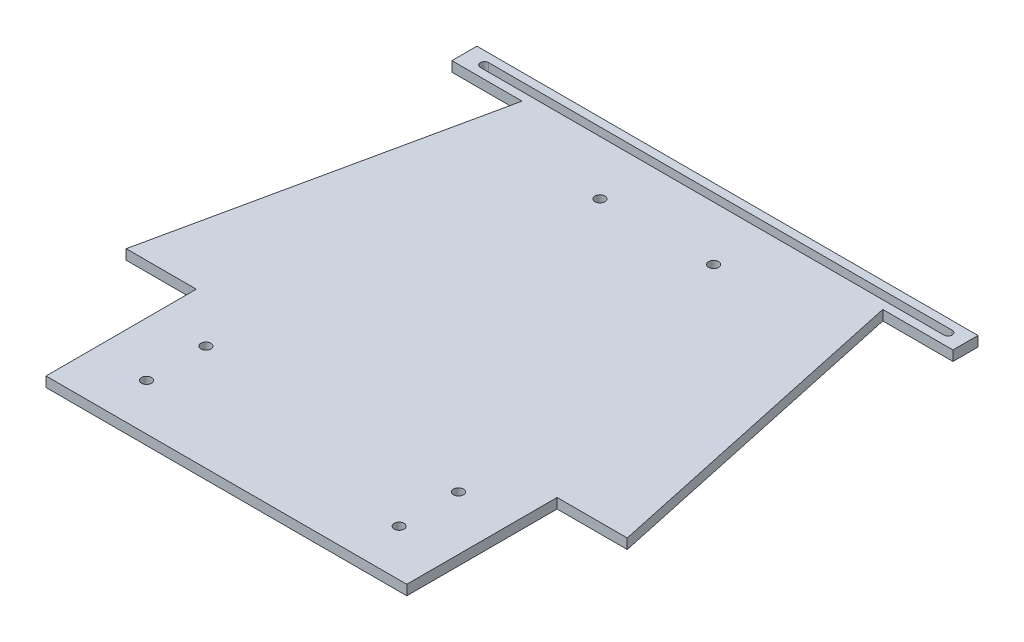
ISO-10303-21;
HEADER;
FILE_DESCRIPTION(('STEP AP214'),'2;1');
FILE_NAME('part.step','',(''),(''),'','','');
FILE_SCHEMA(('AUTOMOTIVE_DESIGN { 1 0 10303 214 1 1 1 1 }'));
ENDSEC;
DATA;
#1=APPLICATION_CONTEXT('core data for automotive mechanical design processes');
#2=APPLICATION_PROTOCOL_DEFINITION('international standard','automotive_design',2000,#1);
#3=PRODUCT_CONTEXT('',#1,'mechanical');
#4=PRODUCT('Part','Part','',(#3));
#5=PRODUCT_RELATED_PRODUCT_CATEGORY('part','',(#4));
#6=PRODUCT_DEFINITION_FORMATION('','',#4);
#7=PRODUCT_DEFINITION_CONTEXT('part definition',#1,'design');
#8=PRODUCT_DEFINITION('design','',#6,#7);
#9=PRODUCT_DEFINITION_SHAPE('','',#8);
#10=(LENGTH_UNIT() NAMED_UNIT(*) SI_UNIT(.MILLI.,.METRE.));
#11=(NAMED_UNIT(*) PLANE_ANGLE_UNIT() SI_UNIT($,.RADIAN.));
#12=(NAMED_UNIT(*) SI_UNIT($,.STERADIAN.) SOLID_ANGLE_UNIT());
#13=UNCERTAINTY_MEASURE_WITH_UNIT(LENGTH_MEASURE(1.E-05),#10,'distance_accuracy_value','');
#14=(GEOMETRIC_REPRESENTATION_CONTEXT(3) GLOBAL_UNCERTAINTY_ASSIGNED_CONTEXT((#13)) GLOBAL_UNIT_ASSIGNED_CONTEXT((#10,
#11,#12)) REPRESENTATION_CONTEXT('',''));
#15=CARTESIAN_POINT('',(0.,0.,0.));
#16=DIRECTION('',(0.,0.,1.));
#17=DIRECTION('',(1.,0.,0.));
#18=AXIS2_PLACEMENT_3D('',#15,#16,#17);
#19=CARTESIAN_POINT('',(0.,4.,0.));
#20=DIRECTION('',(0.,1.,0.));
#21=DIRECTION('',(0.,0.,1.));
#22=AXIS2_PLACEMENT_3D('',#19,#20,#21);
#23=PLANE('',#22);
#24=CARTESIAN_POINT('',(150.417794747506,4.,147.769246608483));
#25=DIRECTION('',(0.,1.,0.));
#26=DIRECTION('',(0.,0.,-1.));
#27=AXIS2_PLACEMENT_3D('',#24,#25,#26);
#28=CIRCLE('',#27,2.);
#29=CARTESIAN_POINT('',(150.417794747506,4.,145.769246608483));
#30=VERTEX_POINT('',#29);
#31=EDGE_CURVE('E209',#30,#30,#28,.T.);
#32=ORIENTED_EDGE('',*,*,#31,.F.);
#33=EDGE_LOOP('',(#32));
#34=FACE_BOUND('',#33,.T.);
#35=CARTESIAN_POINT('',(77.3055757206922,4.,18.2254973298112));
#36=DIRECTION('',(0.,1.,0.));
#37=DIRECTION('',(0.,0.,1.));
#38=AXIS2_PLACEMENT_3D('',#35,#36,#37);
#39=CIRCLE('',#38,2.);
#40=CARTESIAN_POINT('',(77.3055757206922,4.,20.2254973298112));
#41=VERTEX_POINT('',#40);
#42=EDGE_CURVE('E225',#41,#41,#39,.T.);
#43=ORIENTED_EDGE('',*,*,#42,.F.);
#44=EDGE_LOOP('',(#43));
#45=FACE_BOUND('',#44,.T.);
#46=CARTESIAN_POINT('',(49.5822052524939,4.,147.769246608483));
#47=DIRECTION('',(0.,1.,0.));
#48=DIRECTION('',(0.,0.,1.));
#49=AXIS2_PLACEMENT_3D('',#46,#47,#48);
#50=CIRCLE('',#49,2.);
#51=CARTESIAN_POINT('',(49.5822052524939,4.,149.769246608483));
#52=VERTEX_POINT('',#51);
#53=EDGE_CURVE('E241',#52,#52,#50,.T.);
#54=ORIENTED_EDGE('',*,*,#53,.F.);
#55=EDGE_LOOP('',(#54));
#56=FACE_BOUND('',#55,.T.);
#57=DIRECTION('',(0.,0.,1.));
#58=VECTOR('',#57,1.);
#59=CARTESIAN_POINT('',(0.,4.,-10.));
#60=LINE('',#59,#58);
#61=CARTESIAN_POINT('',(0.,4.,-10.));
#62=VERTEX_POINT('',#61);
#63=CARTESIAN_POINT('',(0.,4.,0.));
#64=VERTEX_POINT('',#63);
#65=EDGE_CURVE('E249',#62,#64,#60,.T.);
#66=ORIENTED_EDGE('',*,*,#65,.T.);
#67=DIRECTION('',(1.,0.,0.));
#68=VECTOR('',#67,1.);
#69=CARTESIAN_POINT('',(0.,4.,0.));
#70=LINE('',#69,#68);
#71=CARTESIAN_POINT('',(28.,4.,0.));
#72=VERTEX_POINT('',#71);
#73=EDGE_CURVE('E253',#64,#72,#70,.T.);
#74=ORIENTED_EDGE('',*,*,#73,.T.);
#75=DIRECTION('',(-0.210556075945089,0.,0.977581781173629));
#76=VECTOR('',#75,1.);
#77=CARTESIAN_POINT('',(28.,4.,0.));
#78=LINE('',#77,#76);
#79=CARTESIAN_POINT('',(0.,4.,130.));
#80=VERTEX_POINT('',#79);
#81=EDGE_CURVE('E257',#72,#80,#78,.T.);
#82=ORIENTED_EDGE('',*,*,#81,.T.);
#83=DIRECTION('',(1.,0.,0.));
#84=VECTOR('',#83,1.);
#85=CARTESIAN_POINT('',(0.,4.,130.));
#86=LINE('',#85,#84);
#87=CARTESIAN_POINT('',(28.,4.,130.));
#88=VERTEX_POINT('',#87);
#89=EDGE_CURVE('E260',#80,#88,#86,.T.);
#90=ORIENTED_EDGE('',*,*,#89,.T.);
#91=DIRECTION('',(0.,0.,1.));
#92=VECTOR('',#91,1.);
#93=CARTESIAN_POINT('',(28.,4.,130.));
#94=LINE('',#93,#92);
#95=CARTESIAN_POINT('',(28.,4.,190.));
#96=VERTEX_POINT('',#95);
#97=EDGE_CURVE('E263',#88,#96,#94,.T.);
#98=ORIENTED_EDGE('',*,*,#97,.T.);
#99=DIRECTION('',(1.,0.,0.));
#100=VECTOR('',#99,1.);
#101=CARTESIAN_POINT('',(28.,4.,190.));
#102=LINE('',#101,#100);
#103=CARTESIAN_POINT('',(172.,4.,190.));
#104=VERTEX_POINT('',#103);
#105=EDGE_CURVE('E266',#96,#104,#102,.T.);
#106=ORIENTED_EDGE('',*,*,#105,.T.);
#107=DIRECTION('',(0.,0.,-1.));
#108=VECTOR('',#107,1.);
#109=CARTESIAN_POINT('',(172.,4.,190.));
#110=LINE('',#109,#108);
#111=CARTESIAN_POINT('',(172.,4.,130.));
#112=VERTEX_POINT('',#111);
#113=EDGE_CURVE('E269',#104,#112,#110,.T.);
#114=ORIENTED_EDGE('',*,*,#113,.T.);
#115=DIRECTION('',(1.,0.,0.));
#116=VECTOR('',#115,1.);
#117=CARTESIAN_POINT('',(172.,4.,130.));
#118=LINE('',#117,#116);
#119=CARTESIAN_POINT('',(200.,4.,130.));
#120=VERTEX_POINT('',#119);
#121=EDGE_CURVE('E272',#112,#120,#118,.T.);
#122=ORIENTED_EDGE('',*,*,#121,.T.);
#123=DIRECTION('',(-0.210556075945089,0.,-0.977581781173629));
#124=VECTOR('',#123,1.);
#125=CARTESIAN_POINT('',(200.,4.,130.));
#126=LINE('',#125,#124);
#127=CARTESIAN_POINT('',(172.,4.,0.));
#128=VERTEX_POINT('',#127);
#129=EDGE_CURVE('E275',#120,#128,#126,.T.);
#130=ORIENTED_EDGE('',*,*,#129,.T.);
#131=DIRECTION('',(1.,0.,0.));
#132=VECTOR('',#131,1.);
#133=CARTESIAN_POINT('',(172.,4.,0.));
#134=LINE('',#133,#132);
#135=CARTESIAN_POINT('',(200.,4.,0.));
#136=VERTEX_POINT('',#135);
#137=EDGE_CURVE('E278',#128,#136,#134,.T.);
#138=ORIENTED_EDGE('',*,*,#137,.T.);
#139=DIRECTION('',(0.,0.,-1.));
#140=VECTOR('',#139,1.);
#141=CARTESIAN_POINT('',(200.,4.,0.));
#142=LINE('',#141,#140);
#143=CARTESIAN_POINT('',(200.,4.,-10.));
#144=VERTEX_POINT('',#143);
#145=EDGE_CURVE('E281',#136,#144,#142,.T.);
#146=ORIENTED_EDGE('',*,*,#145,.T.);
#147=DIRECTION('',(-1.,0.,0.));
#148=VECTOR('',#147,1.);
#149=CARTESIAN_POINT('',(200.,4.,-10.));
#150=LINE('',#149,#148);
#151=EDGE_CURVE('E284',#144,#62,#150,.T.);
#152=ORIENTED_EDGE('',*,*,#151,.T.);
#153=EDGE_LOOP('',(#66,#74,#82,#90,#98,#106,#114,#122,#130,#138,#146,#152));
#154=FACE_BOUND('',#153,.T.);
#155=CARTESIAN_POINT('',(49.5822052524939,4.,171.460126826762));
#156=DIRECTION('',(0.,1.,0.));
#157=DIRECTION('',(0.,0.,1.));
#158=AXIS2_PLACEMENT_3D('',#155,#156,#157);
#159=CIRCLE('',#158,2.);
#160=CARTESIAN_POINT('',(49.5822052524939,4.,173.460126826762));
#161=VERTEX_POINT('',#160);
#162=EDGE_CURVE('E233',#161,#161,#159,.T.);
#163=ORIENTED_EDGE('',*,*,#162,.F.);
#164=EDGE_LOOP('',(#163));
#165=FACE_BOUND('',#164,.T.);
#166=CARTESIAN_POINT('',(150.417794747506,4.,171.460126826762));
#167=DIRECTION('',(0.,1.,0.));
#168=DIRECTION('',(0.,0.,-1.));
#169=AXIS2_PLACEMENT_3D('',#166,#167,#168);
#170=CIRCLE('',#169,2.);
#171=CARTESIAN_POINT('',(150.417794747506,4.,169.460126826762));
#172=VERTEX_POINT('',#171);
#173=EDGE_CURVE('E217',#172,#172,#170,.T.);
#174=ORIENTED_EDGE('',*,*,#173,.F.);
#175=EDGE_LOOP('',(#174));
#176=FACE_BOUND('',#175,.T.);
#177=CARTESIAN_POINT('',(122.694424279308,4.,18.2254973298112));
#178=DIRECTION('',(0.,1.,0.));
#179=DIRECTION('',(0.,0.,-1.));
#180=AXIS2_PLACEMENT_3D('',#177,#178,#179);
#181=CIRCLE('',#180,2.);
#182=CARTESIAN_POINT('',(122.694424279308,4.,16.2254973298112));
#183=VERTEX_POINT('',#182);
#184=EDGE_CURVE('E201',#183,#183,#181,.T.);
#185=ORIENTED_EDGE('',*,*,#184,.F.);
#186=EDGE_LOOP('',(#185));
#187=FACE_BOUND('',#186,.T.);
#188=DIRECTION('',(1.,0.,0.));
#189=VECTOR('',#188,1.);
#190=CARTESIAN_POINT('',(8.04576511181479,4.,-3.34354151504071));
#191=LINE('',#190,#189);
#192=CARTESIAN_POINT('',(8.04576511181479,4.,-3.34354151504071));
#193=VERTEX_POINT('',#192);
#194=CARTESIAN_POINT('',(193.045765111815,4.,-3.34354151504071));
#195=VERTEX_POINT('',#194);
#196=EDGE_CURVE('E162',#193,#195,#191,.T.);
#197=ORIENTED_EDGE('',*,*,#196,.F.);
#198=CARTESIAN_POINT('',(8.04576511181479,4.,-5.));
#199=DIRECTION('',(0.,1.,0.));
#200=DIRECTION('',(0.,0.,1.));
#201=AXIS2_PLACEMENT_3D('',#198,#199,#200);
#202=CIRCLE('',#201,1.65645848495929);
#203=CARTESIAN_POINT('',(8.04576511181479,4.,-6.65645848495929));
#204=VERTEX_POINT('',#203);
#205=EDGE_CURVE('E153',#204,#193,#202,.T.);
#206=ORIENTED_EDGE('',*,*,#205,.F.);
#207=DIRECTION('',(-1.,0.,0.));
#208=VECTOR('',#207,1.);
#209=CARTESIAN_POINT('',(8.04576511181479,4.,-6.65645848495929));
#210=LINE('',#209,#208);
#211=CARTESIAN_POINT('',(193.045765111815,4.,-6.65645848495929));
#212=VERTEX_POINT('',#211);
#213=EDGE_CURVE('E179',#212,#204,#210,.T.);
#214=ORIENTED_EDGE('',*,*,#213,.F.);
#215=CARTESIAN_POINT('',(193.045765111815,4.,-5.));
#216=DIRECTION('',(0.,1.,0.));
#217=DIRECTION('',(0.,0.,1.));
#218=AXIS2_PLACEMENT_3D('',#215,#216,#217);
#219=CIRCLE('',#218,1.65645848495929);
#220=EDGE_CURVE('E175',#195,#212,#219,.T.);
#221=ORIENTED_EDGE('',*,*,#220,.F.);
#222=EDGE_LOOP('',(#197,#206,#214,#221));
#223=FACE_BOUND('',#222,.T.);
#224=ADVANCED_FACE('F39',(#34,#45,#56,#154,#165,#176,#187,#223),#23,.T.);
#225=CARTESIAN_POINT('',(0.,0.,0.));
#226=DIRECTION('',(0.,1.,0.));
#227=DIRECTION('',(0.,0.,1.));
#228=AXIS2_PLACEMENT_3D('',#225,#226,#227);
#229=PLANE('',#228);
#230=CARTESIAN_POINT('',(122.694424279308,0.,18.2254973298112));
#231=DIRECTION('',(0.,1.,0.));
#232=DIRECTION('',(0.,0.,-1.));
#233=AXIS2_PLACEMENT_3D('',#230,#231,#232);
#234=CIRCLE('',#233,2.);
#235=CARTESIAN_POINT('',(122.694424279308,0.,16.2254973298112));
#236=VERTEX_POINT('',#235);
#237=EDGE_CURVE('E171',#236,#236,#234,.T.);
#238=ORIENTED_EDGE('',*,*,#237,.T.);
#239=EDGE_LOOP('',(#238));
#240=FACE_BOUND('',#239,.T.);
#241=CARTESIAN_POINT('',(150.417794747506,0.,147.769246608483));
#242=DIRECTION('',(0.,1.,0.));
#243=DIRECTION('',(0.,0.,-1.));
#244=AXIS2_PLACEMENT_3D('',#241,#242,#243);
#245=CIRCLE('',#244,2.);
#246=CARTESIAN_POINT('',(150.417794747506,0.,145.769246608483));
#247=VERTEX_POINT('',#246);
#248=EDGE_CURVE('E205',#247,#247,#245,.T.);
#249=ORIENTED_EDGE('',*,*,#248,.T.);
#250=EDGE_LOOP('',(#249));
#251=FACE_BOUND('',#250,.T.);
#252=CARTESIAN_POINT('',(150.417794747506,0.,171.460126826762));
#253=DIRECTION('',(0.,1.,0.));
#254=DIRECTION('',(0.,0.,-1.));
#255=AXIS2_PLACEMENT_3D('',#252,#253,#254);
#256=CIRCLE('',#255,2.);
#257=CARTESIAN_POINT('',(150.417794747506,0.,169.460126826762));
#258=VERTEX_POINT('',#257);
#259=EDGE_CURVE('E213',#258,#258,#256,.T.);
#260=ORIENTED_EDGE('',*,*,#259,.T.);
#261=EDGE_LOOP('',(#260));
#262=FACE_BOUND('',#261,.T.);
#263=CARTESIAN_POINT('',(77.3055757206922,0.,18.2254973298112));
#264=DIRECTION('',(0.,1.,0.));
#265=DIRECTION('',(0.,0.,1.));
#266=AXIS2_PLACEMENT_3D('',#263,#264,#265);
#267=CIRCLE('',#266,2.);
#268=CARTESIAN_POINT('',(77.3055757206922,0.,20.2254973298112));
#269=VERTEX_POINT('',#268);
#270=EDGE_CURVE('E221',#269,#269,#267,.T.);
#271=ORIENTED_EDGE('',*,*,#270,.T.);
#272=EDGE_LOOP('',(#271));
#273=FACE_BOUND('',#272,.T.);
#274=CARTESIAN_POINT('',(49.5822052524939,0.,171.460126826762));
#275=DIRECTION('',(0.,1.,0.));
#276=DIRECTION('',(0.,0.,1.));
#277=AXIS2_PLACEMENT_3D('',#274,#275,#276);
#278=CIRCLE('',#277,2.);
#279=CARTESIAN_POINT('',(49.5822052524939,0.,173.460126826762));
#280=VERTEX_POINT('',#279);
#281=EDGE_CURVE('E229',#280,#280,#278,.T.);
#282=ORIENTED_EDGE('',*,*,#281,.T.);
#283=EDGE_LOOP('',(#282));
#284=FACE_BOUND('',#283,.T.);
#285=CARTESIAN_POINT('',(49.5822052524939,0.,147.769246608483));
#286=DIRECTION('',(0.,1.,0.));
#287=DIRECTION('',(0.,0.,1.));
#288=AXIS2_PLACEMENT_3D('',#285,#286,#287);
#289=CIRCLE('',#288,2.);
#290=CARTESIAN_POINT('',(49.5822052524939,0.,149.769246608483));
#291=VERTEX_POINT('',#290);
#292=EDGE_CURVE('E237',#291,#291,#289,.T.);
#293=ORIENTED_EDGE('',*,*,#292,.T.);
#294=EDGE_LOOP('',(#293));
#295=FACE_BOUND('',#294,.T.);
#296=DIRECTION('',(0.,0.,1.));
#297=VECTOR('',#296,1.);
#298=CARTESIAN_POINT('',(0.,0.,-10.));
#299=LINE('',#298,#297);
#300=CARTESIAN_POINT('',(0.,0.,-10.));
#301=VERTEX_POINT('',#300);
#302=CARTESIAN_POINT('',(0.,0.,0.));
#303=VERTEX_POINT('',#302);
#304=EDGE_CURVE('E245',#301,#303,#299,.T.);
#305=ORIENTED_EDGE('',*,*,#304,.F.);
#306=DIRECTION('',(-1.,0.,0.));
#307=VECTOR('',#306,1.);
#308=CARTESIAN_POINT('',(200.,0.,-10.));
#309=LINE('',#308,#307);
#310=CARTESIAN_POINT('',(200.,0.,-10.));
#311=VERTEX_POINT('',#310);
#312=EDGE_CURVE('E254',#311,#301,#309,.T.);
#313=ORIENTED_EDGE('',*,*,#312,.F.);
#314=DIRECTION('',(0.,0.,-1.));
#315=VECTOR('',#314,1.);
#316=CARTESIAN_POINT('',(200.,0.,0.));
#317=LINE('',#316,#315);
#318=CARTESIAN_POINT('',(200.,0.,0.));
#319=VERTEX_POINT('',#318);
#320=EDGE_CURVE('E318',#319,#311,#317,.T.);
#321=ORIENTED_EDGE('',*,*,#320,.F.);
#322=DIRECTION('',(1.,0.,0.));
#323=VECTOR('',#322,1.);
#324=CARTESIAN_POINT('',(172.,0.,0.));
#325=LINE('',#324,#323);
#326=CARTESIAN_POINT('',(172.,0.,0.));
#327=VERTEX_POINT('',#326);
#328=EDGE_CURVE('E315',#327,#319,#325,.T.);
#329=ORIENTED_EDGE('',*,*,#328,.F.);
#330=DIRECTION('',(-0.210556075945089,0.,-0.977581781173629));
#331=VECTOR('',#330,1.);
#332=CARTESIAN_POINT('',(200.,0.,130.));
#333=LINE('',#332,#331);
#334=CARTESIAN_POINT('',(200.,0.,130.));
#335=VERTEX_POINT('',#334);
#336=EDGE_CURVE('E312',#335,#327,#333,.T.);
#337=ORIENTED_EDGE('',*,*,#336,.F.);
#338=DIRECTION('',(1.,0.,0.));
#339=VECTOR('',#338,1.);
#340=CARTESIAN_POINT('',(172.,0.,130.));
#341=LINE('',#340,#339);
#342=CARTESIAN_POINT('',(172.,0.,130.));
#343=VERTEX_POINT('',#342);
#344=EDGE_CURVE('E309',#343,#335,#341,.T.);
#345=ORIENTED_EDGE('',*,*,#344,.F.);
#346=DIRECTION('',(0.,0.,-1.));
#347=VECTOR('',#346,1.);
#348=CARTESIAN_POINT('',(172.,0.,190.));
#349=LINE('',#348,#347);
#350=CARTESIAN_POINT('',(172.,0.,190.));
#351=VERTEX_POINT('',#350);
#352=EDGE_CURVE('E306',#351,#343,#349,.T.);
#353=ORIENTED_EDGE('',*,*,#352,.F.);
#354=DIRECTION('',(1.,0.,0.));
#355=VECTOR('',#354,1.);
#356=CARTESIAN_POINT('',(28.,0.,190.));
#357=LINE('',#356,#355);
#358=CARTESIAN_POINT('',(28.,0.,190.));
#359=VERTEX_POINT('',#358);
#360=EDGE_CURVE('E303',#359,#351,#357,.T.);
#361=ORIENTED_EDGE('',*,*,#360,.F.);
#362=DIRECTION('',(0.,0.,1.));
#363=VECTOR('',#362,1.);
#364=CARTESIAN_POINT('',(28.,0.,130.));
#365=LINE('',#364,#363);
#366=CARTESIAN_POINT('',(28.,0.,130.));
#367=VERTEX_POINT('',#366);
#368=EDGE_CURVE('E300',#367,#359,#365,.T.);
#369=ORIENTED_EDGE('',*,*,#368,.F.);
#370=DIRECTION('',(1.,0.,0.));
#371=VECTOR('',#370,1.);
#372=CARTESIAN_POINT('',(0.,0.,130.));
#373=LINE('',#372,#371);
#374=CARTESIAN_POINT('',(0.,0.,130.));
#375=VERTEX_POINT('',#374);
#376=EDGE_CURVE('E297',#375,#367,#373,.T.);
#377=ORIENTED_EDGE('',*,*,#376,.F.);
#378=DIRECTION('',(-0.210556075945089,0.,0.977581781173629));
#379=VECTOR('',#378,1.);
#380=CARTESIAN_POINT('',(28.,0.,0.));
#381=LINE('',#380,#379);
#382=CARTESIAN_POINT('',(28.,0.,0.));
#383=VERTEX_POINT('',#382);
#384=EDGE_CURVE('E294',#383,#375,#381,.T.);
#385=ORIENTED_EDGE('',*,*,#384,.F.);
#386=DIRECTION('',(1.,0.,0.));
#387=VECTOR('',#386,1.);
#388=CARTESIAN_POINT('',(0.,0.,0.));
#389=LINE('',#388,#387);
#390=EDGE_CURVE('E291',#303,#383,#389,.T.);
#391=ORIENTED_EDGE('',*,*,#390,.F.);
#392=EDGE_LOOP('',(#305,#313,#321,#329,#337,#345,#353,#361,#369,#377,#385,#391));
#393=FACE_BOUND('',#392,.T.);
#394=CARTESIAN_POINT('',(8.04576511181479,0.,-5.));
#395=DIRECTION('',(0.,1.,0.));
#396=DIRECTION('',(0.,0.,1.));
#397=AXIS2_PLACEMENT_3D('',#394,#395,#396);
#398=CIRCLE('',#397,1.65645848495929);
#399=CARTESIAN_POINT('',(8.04576511181479,0.,-6.65645848495929));
#400=VERTEX_POINT('',#399);
#401=CARTESIAN_POINT('',(8.04576511181479,0.,-3.34354151504071));
#402=VERTEX_POINT('',#401);
#403=EDGE_CURVE('E63',#400,#402,#398,.T.);
#404=ORIENTED_EDGE('',*,*,#403,.T.);
#405=DIRECTION('',(1.,0.,0.));
#406=VECTOR('',#405,1.);
#407=CARTESIAN_POINT('',(8.04576511181479,0.,-3.34354151504071));
#408=LINE('',#407,#406);
#409=CARTESIAN_POINT('',(193.045765111815,0.,-3.34354151504071));
#410=VERTEX_POINT('',#409);
#411=EDGE_CURVE('E169',#402,#410,#408,.T.);
#412=ORIENTED_EDGE('',*,*,#411,.T.);
#413=CARTESIAN_POINT('',(193.045765111815,0.,-5.));
#414=DIRECTION('',(0.,1.,0.));
#415=DIRECTION('',(0.,0.,1.));
#416=AXIS2_PLACEMENT_3D('',#413,#414,#415);
#417=CIRCLE('',#416,1.65645848495929);
#418=CARTESIAN_POINT('',(193.045765111815,0.,-6.65645848495929));
#419=VERTEX_POINT('',#418);
#420=EDGE_CURVE('E188',#410,#419,#417,.T.);
#421=ORIENTED_EDGE('',*,*,#420,.T.);
#422=DIRECTION('',(-1.,0.,0.));
#423=VECTOR('',#422,1.);
#424=CARTESIAN_POINT('',(8.04576511181479,0.,-6.65645848495929));
#425=LINE('',#424,#423);
#426=EDGE_CURVE('E163',#419,#400,#425,.T.);
#427=ORIENTED_EDGE('',*,*,#426,.T.);
#428=EDGE_LOOP('',(#404,#412,#421,#427));
#429=FACE_BOUND('',#428,.T.);
#430=ADVANCED_FACE('F373',(#240,#251,#262,#273,#284,#295,#393,#429),#229,.F.);
#431=CARTESIAN_POINT('',(0.,4.,-10.));
#432=DIRECTION('',(1.,0.,0.));
#433=DIRECTION('',(0.,0.,-1.));
#434=AXIS2_PLACEMENT_3D('',#431,#432,#433);
#435=PLANE('',#434);
#436=ORIENTED_EDGE('',*,*,#304,.T.);
#437=DIRECTION('',(0.,-1.,0.));
#438=VECTOR('',#437,1.);
#439=CARTESIAN_POINT('',(0.,4.,0.));
#440=LINE('',#439,#438);
#441=EDGE_CURVE('E11',#64,#303,#440,.T.);
#442=ORIENTED_EDGE('',*,*,#441,.F.);
#443=ORIENTED_EDGE('',*,*,#65,.F.);
#444=DIRECTION('',(0.,-1.,0.));
#445=VECTOR('',#444,1.);
#446=CARTESIAN_POINT('',(0.,4.,-10.));
#447=LINE('',#446,#445);
#448=EDGE_CURVE('E287',#62,#301,#447,.T.);
#449=ORIENTED_EDGE('',*,*,#448,.T.);
#450=EDGE_LOOP('',(#436,#442,#443,#449));
#451=FACE_BOUND('',#450,.T.);
#452=ADVANCED_FACE('F41',(#451),#435,.F.);
#453=CARTESIAN_POINT('',(0.,4.,0.));
#454=DIRECTION('',(0.,0.,-1.));
#455=DIRECTION('',(-1.,0.,0.));
#456=AXIS2_PLACEMENT_3D('',#453,#454,#455);
#457=PLANE('',#456);
#458=ORIENTED_EDGE('',*,*,#390,.T.);
#459=DIRECTION('',(0.,-1.,0.));
#460=VECTOR('',#459,1.);
#461=CARTESIAN_POINT('',(28.,4.,0.));
#462=LINE('',#461,#460);
#463=EDGE_CURVE('E48',#72,#383,#462,.T.);
#464=ORIENTED_EDGE('',*,*,#463,.F.);
#465=ORIENTED_EDGE('',*,*,#73,.F.);
#466=ORIENTED_EDGE('',*,*,#441,.T.);
#467=EDGE_LOOP('',(#458,#464,#465,#466));
#468=FACE_BOUND('',#467,.T.);
#469=ADVANCED_FACE('F391',(#468),#457,.F.);
#470=CARTESIAN_POINT('',(28.,4.,0.));
#471=DIRECTION('',(0.977581781173629,0.,0.210556075945089));
#472=DIRECTION('',(0.210556075945089,0.,-0.977581781173629));
#473=AXIS2_PLACEMENT_3D('',#470,#471,#472);
#474=PLANE('',#473);
#475=ORIENTED_EDGE('',*,*,#384,.T.);
#476=DIRECTION('',(0.,-1.,0.));
#477=VECTOR('',#476,1.);
#478=CARTESIAN_POINT('',(0.,4.,130.));
#479=LINE('',#478,#477);
#480=EDGE_CURVE('E358',#80,#375,#479,.T.);
#481=ORIENTED_EDGE('',*,*,#480,.F.);
#482=ORIENTED_EDGE('',*,*,#81,.F.);
#483=ORIENTED_EDGE('',*,*,#463,.T.);
#484=EDGE_LOOP('',(#475,#481,#482,#483));
#485=FACE_BOUND('',#484,.T.);
#486=ADVANCED_FACE('F367',(#485),#474,.F.);
#487=CARTESIAN_POINT('',(0.,4.,130.));
#488=DIRECTION('',(0.,0.,-1.));
#489=DIRECTION('',(-1.,0.,0.));
#490=AXIS2_PLACEMENT_3D('',#487,#488,#489);
#491=PLANE('',#490);
#492=ORIENTED_EDGE('',*,*,#376,.T.);
#493=DIRECTION('',(0.,-1.,0.));
#494=VECTOR('',#493,1.);
#495=CARTESIAN_POINT('',(28.,4.,130.));
#496=LINE('',#495,#494);
#497=EDGE_CURVE('E354',#88,#367,#496,.T.);
#498=ORIENTED_EDGE('',*,*,#497,.F.);
#499=ORIENTED_EDGE('',*,*,#89,.F.);
#500=ORIENTED_EDGE('',*,*,#480,.T.);
#501=EDGE_LOOP('',(#492,#498,#499,#500));
#502=FACE_BOUND('',#501,.T.);
#503=ADVANCED_FACE('F379',(#502),#491,.F.);
#504=CARTESIAN_POINT('',(28.,4.,130.));
#505=DIRECTION('',(1.,0.,0.));
#506=DIRECTION('',(0.,0.,-1.));
#507=AXIS2_PLACEMENT_3D('',#504,#505,#506);
#508=PLANE('',#507);
#509=ORIENTED_EDGE('',*,*,#368,.T.);
#510=DIRECTION('',(0.,-1.,0.));
#511=VECTOR('',#510,1.);
#512=CARTESIAN_POINT('',(28.,4.,190.));
#513=LINE('',#512,#511);
#514=EDGE_CURVE('E350',#96,#359,#513,.T.);
#515=ORIENTED_EDGE('',*,*,#514,.F.);
#516=ORIENTED_EDGE('',*,*,#97,.F.);
#517=ORIENTED_EDGE('',*,*,#497,.T.);
#518=EDGE_LOOP('',(#509,#515,#516,#517));
#519=FACE_BOUND('',#518,.T.);
#520=ADVANCED_FACE('F383',(#519),#508,.F.);
#521=CARTESIAN_POINT('',(28.,4.,190.));
#522=DIRECTION('',(0.,0.,-1.));
#523=DIRECTION('',(-1.,0.,0.));
#524=AXIS2_PLACEMENT_3D('',#521,#522,#523);
#525=PLANE('',#524);
#526=ORIENTED_EDGE('',*,*,#360,.T.);
#527=DIRECTION('',(0.,-1.,0.));
#528=VECTOR('',#527,1.);
#529=CARTESIAN_POINT('',(172.,4.,190.));
#530=LINE('',#529,#528);
#531=EDGE_CURVE('E346',#104,#351,#530,.T.);
#532=ORIENTED_EDGE('',*,*,#531,.F.);
#533=ORIENTED_EDGE('',*,*,#105,.F.);
#534=ORIENTED_EDGE('',*,*,#514,.T.);
#535=EDGE_LOOP('',(#526,#532,#533,#534));
#536=FACE_BOUND('',#535,.T.);
#537=ADVANCED_FACE('F424',(#536),#525,.F.);
#538=CARTESIAN_POINT('',(172.,4.,190.));
#539=DIRECTION('',(-1.,0.,0.));
#540=DIRECTION('',(0.,0.,1.));
#541=AXIS2_PLACEMENT_3D('',#538,#539,#540);
#542=PLANE('',#541);
#543=ORIENTED_EDGE('',*,*,#352,.T.);
#544=DIRECTION('',(0.,-1.,0.));
#545=VECTOR('',#544,1.);
#546=CARTESIAN_POINT('',(172.,4.,130.));
#547=LINE('',#546,#545);
#548=EDGE_CURVE('E342',#112,#343,#547,.T.);
#549=ORIENTED_EDGE('',*,*,#548,.F.);
#550=ORIENTED_EDGE('',*,*,#113,.F.);
#551=ORIENTED_EDGE('',*,*,#531,.T.);
#552=EDGE_LOOP('',(#543,#549,#550,#551));
#553=FACE_BOUND('',#552,.T.);
#554=ADVANCED_FACE('F422',(#553),#542,.F.);
#555=CARTESIAN_POINT('',(172.,4.,130.));
#556=DIRECTION('',(0.,0.,-1.));
#557=DIRECTION('',(-1.,0.,0.));
#558=AXIS2_PLACEMENT_3D('',#555,#556,#557);
#559=PLANE('',#558);
#560=ORIENTED_EDGE('',*,*,#344,.T.);
#561=DIRECTION('',(0.,-1.,0.));
#562=VECTOR('',#561,1.);
#563=CARTESIAN_POINT('',(200.,4.,130.));
#564=LINE('',#563,#562);
#565=EDGE_CURVE('E338',#120,#335,#564,.T.);
#566=ORIENTED_EDGE('',*,*,#565,.F.);
#567=ORIENTED_EDGE('',*,*,#121,.F.);
#568=ORIENTED_EDGE('',*,*,#548,.T.);
#569=EDGE_LOOP('',(#560,#566,#567,#568));
#570=FACE_BOUND('',#569,.T.);
#571=ADVANCED_FACE('F418',(#570),#559,.F.);
#572=CARTESIAN_POINT('',(200.,4.,130.));
#573=DIRECTION('',(-0.977581781173629,0.,0.210556075945089));
#574=DIRECTION('',(0.210556075945089,0.,0.977581781173629));
#575=AXIS2_PLACEMENT_3D('',#572,#573,#574);
#576=PLANE('',#575);
#577=ORIENTED_EDGE('',*,*,#336,.T.);
#578=DIRECTION('',(0.,-1.,0.));
#579=VECTOR('',#578,1.);
#580=CARTESIAN_POINT('',(172.,4.,0.));
#581=LINE('',#580,#579);
#582=EDGE_CURVE('E334',#128,#327,#581,.T.);
#583=ORIENTED_EDGE('',*,*,#582,.F.);
#584=ORIENTED_EDGE('',*,*,#129,.F.);
#585=ORIENTED_EDGE('',*,*,#565,.T.);
#586=EDGE_LOOP('',(#577,#583,#584,#585));
#587=FACE_BOUND('',#586,.T.);
#588=ADVANCED_FACE('F413',(#587),#576,.F.);
#589=CARTESIAN_POINT('',(172.,4.,0.));
#590=DIRECTION('',(0.,0.,-1.));
#591=DIRECTION('',(-1.,0.,0.));
#592=AXIS2_PLACEMENT_3D('',#589,#590,#591);
#593=PLANE('',#592);
#594=ORIENTED_EDGE('',*,*,#328,.T.);
#595=DIRECTION('',(0.,-1.,0.));
#596=VECTOR('',#595,1.);
#597=CARTESIAN_POINT('',(200.,4.,0.));
#598=LINE('',#597,#596);
#599=EDGE_CURVE('E330',#136,#319,#598,.T.);
#600=ORIENTED_EDGE('',*,*,#599,.F.);
#601=ORIENTED_EDGE('',*,*,#137,.F.);
#602=ORIENTED_EDGE('',*,*,#582,.T.);
#603=EDGE_LOOP('',(#594,#600,#601,#602));
#604=FACE_BOUND('',#603,.T.);
#605=ADVANCED_FACE('F407',(#604),#593,.F.);
#606=CARTESIAN_POINT('',(200.,4.,0.));
#607=DIRECTION('',(-1.,0.,0.));
#608=DIRECTION('',(0.,0.,1.));
#609=AXIS2_PLACEMENT_3D('',#606,#607,#608);
#610=PLANE('',#609);
#611=ORIENTED_EDGE('',*,*,#320,.T.);
#612=DIRECTION('',(0.,-1.,0.));
#613=VECTOR('',#612,1.);
#614=CARTESIAN_POINT('',(200.,4.,-10.));
#615=LINE('',#614,#613);
#616=EDGE_CURVE('E326',#144,#311,#615,.T.);
#617=ORIENTED_EDGE('',*,*,#616,.F.);
#618=ORIENTED_EDGE('',*,*,#145,.F.);
#619=ORIENTED_EDGE('',*,*,#599,.T.);
#620=EDGE_LOOP('',(#611,#617,#618,#619));
#621=FACE_BOUND('',#620,.T.);
#622=ADVANCED_FACE('F403',(#621),#610,.F.);
#623=CARTESIAN_POINT('',(200.,4.,-10.));
#624=DIRECTION('',(0.,0.,1.));
#625=DIRECTION('',(1.,0.,0.));
#626=AXIS2_PLACEMENT_3D('',#623,#624,#625);
#627=PLANE('',#626);
#628=ORIENTED_EDGE('',*,*,#312,.T.);
#629=ORIENTED_EDGE('',*,*,#448,.F.);
#630=ORIENTED_EDGE('',*,*,#151,.F.);
#631=ORIENTED_EDGE('',*,*,#616,.T.);
#632=EDGE_LOOP('',(#628,#629,#630,#631));
#633=FACE_BOUND('',#632,.T.);
#634=ADVANCED_FACE('F398',(#633),#627,.F.);
#635=CARTESIAN_POINT('',(49.5822052524939,4.,147.769246608483));
#636=DIRECTION('',(0.,-1.,0.));
#637=DIRECTION('',(0.,0.,-1.));
#638=AXIS2_PLACEMENT_3D('',#635,#636,#637);
#639=CYLINDRICAL_SURFACE('',#638,2.);
#640=ORIENTED_EDGE('',*,*,#53,.T.);
#641=EDGE_LOOP('',(#640));
#642=FACE_BOUND('',#641,.T.);
#643=ORIENTED_EDGE('',*,*,#292,.F.);
#644=EDGE_LOOP('',(#643));
#645=FACE_BOUND('',#644,.T.);
#646=ADVANCED_FACE('F444',(#642,#645),#639,.F.);
#647=CARTESIAN_POINT('',(49.5822052524939,4.,171.460126826762));
#648=DIRECTION('',(0.,-1.,0.));
#649=DIRECTION('',(0.,0.,-1.));
#650=AXIS2_PLACEMENT_3D('',#647,#648,#649);
#651=CYLINDRICAL_SURFACE('',#650,2.);
#652=ORIENTED_EDGE('',*,*,#162,.T.);
#653=EDGE_LOOP('',(#652));
#654=FACE_BOUND('',#653,.T.);
#655=ORIENTED_EDGE('',*,*,#281,.F.);
#656=EDGE_LOOP('',(#655));
#657=FACE_BOUND('',#656,.T.);
#658=ADVANCED_FACE('F482',(#654,#657),#651,.F.);
#659=CARTESIAN_POINT('',(77.3055757206922,4.,18.2254973298112));
#660=DIRECTION('',(0.,-1.,0.));
#661=DIRECTION('',(0.,0.,-1.));
#662=AXIS2_PLACEMENT_3D('',#659,#660,#661);
#663=CYLINDRICAL_SURFACE('',#662,2.);
#664=ORIENTED_EDGE('',*,*,#42,.T.);
#665=EDGE_LOOP('',(#664));
#666=FACE_BOUND('',#665,.T.);
#667=ORIENTED_EDGE('',*,*,#270,.F.);
#668=EDGE_LOOP('',(#667));
#669=FACE_BOUND('',#668,.T.);
#670=ADVANCED_FACE('F489',(#666,#669),#663,.F.);
#671=CARTESIAN_POINT('',(150.417794747506,4.,171.460126826762));
#672=DIRECTION('',(0.,-1.,0.));
#673=DIRECTION('',(0.,0.,-1.));
#674=AXIS2_PLACEMENT_3D('',#671,#672,#673);
#675=CYLINDRICAL_SURFACE('',#674,2.);
#676=ORIENTED_EDGE('',*,*,#173,.T.);
#677=EDGE_LOOP('',(#676));
#678=FACE_BOUND('',#677,.T.);
#679=ORIENTED_EDGE('',*,*,#259,.F.);
#680=EDGE_LOOP('',(#679));
#681=FACE_BOUND('',#680,.T.);
#682=ADVANCED_FACE('F496',(#678,#681),#675,.F.);
#683=CARTESIAN_POINT('',(150.417794747506,4.,147.769246608483));
#684=DIRECTION('',(0.,-1.,0.));
#685=DIRECTION('',(0.,0.,-1.));
#686=AXIS2_PLACEMENT_3D('',#683,#684,#685);
#687=CYLINDRICAL_SURFACE('',#686,2.);
#688=ORIENTED_EDGE('',*,*,#31,.T.);
#689=EDGE_LOOP('',(#688));
#690=FACE_BOUND('',#689,.T.);
#691=ORIENTED_EDGE('',*,*,#248,.F.);
#692=EDGE_LOOP('',(#691));
#693=FACE_BOUND('',#692,.T.);
#694=ADVANCED_FACE('F504',(#690,#693),#687,.F.);
#695=CARTESIAN_POINT('',(122.694424279308,4.,18.2254973298112));
#696=DIRECTION('',(0.,-1.,0.));
#697=DIRECTION('',(0.,0.,-1.));
#698=AXIS2_PLACEMENT_3D('',#695,#696,#697);
#699=CYLINDRICAL_SURFACE('',#698,2.);
#700=ORIENTED_EDGE('',*,*,#184,.T.);
#701=EDGE_LOOP('',(#700));
#702=FACE_BOUND('',#701,.T.);
#703=ORIENTED_EDGE('',*,*,#237,.F.);
#704=EDGE_LOOP('',(#703));
#705=FACE_BOUND('',#704,.T.);
#706=ADVANCED_FACE('F512',(#702,#705),#699,.F.);
#707=CARTESIAN_POINT('',(8.04576511181479,4.,-5.));
#708=DIRECTION('',(0.,-1.,0.));
#709=DIRECTION('',(0.,0.,-1.));
#710=AXIS2_PLACEMENT_3D('',#707,#708,#709);
#711=CYLINDRICAL_SURFACE('',#710,1.65645848495929);
#712=ORIENTED_EDGE('',*,*,#403,.F.);
#713=DIRECTION('',(0.,-1.,0.));
#714=VECTOR('',#713,1.);
#715=CARTESIAN_POINT('',(8.04576511181479,4.,-6.65645848495929));
#716=LINE('',#715,#714);
#717=EDGE_CURVE('E157',#204,#400,#716,.T.);
#718=ORIENTED_EDGE('',*,*,#717,.F.);
#719=ORIENTED_EDGE('',*,*,#205,.T.);
#720=DIRECTION('',(0.,-1.,0.));
#721=VECTOR('',#720,1.);
#722=CARTESIAN_POINT('',(8.04576511181479,4.,-3.34354151504071));
#723=LINE('',#722,#721);
#724=EDGE_CURVE('E156',#193,#402,#723,.T.);
#725=ORIENTED_EDGE('',*,*,#724,.T.);
#726=EDGE_LOOP('',(#712,#718,#719,#725));
#727=FACE_BOUND('',#726,.T.);
#728=ADVANCED_FACE('F155',(#727),#711,.F.);
#729=CARTESIAN_POINT('',(8.04576511181479,4.,-3.34354151504071));
#730=DIRECTION('',(0.,0.,-1.));
#731=DIRECTION('',(-1.,0.,0.));
#732=AXIS2_PLACEMENT_3D('',#729,#730,#731);
#733=PLANE('',#732);
#734=ORIENTED_EDGE('',*,*,#411,.F.);
#735=ORIENTED_EDGE('',*,*,#724,.F.);
#736=ORIENTED_EDGE('',*,*,#196,.T.);
#737=DIRECTION('',(0.,-1.,0.));
#738=VECTOR('',#737,1.);
#739=CARTESIAN_POINT('',(193.045765111815,4.,-3.34354151504071));
#740=LINE('',#739,#738);
#741=EDGE_CURVE('E172',#195,#410,#740,.T.);
#742=ORIENTED_EDGE('',*,*,#741,.T.);
#743=EDGE_LOOP('',(#734,#735,#736,#742));
#744=FACE_BOUND('',#743,.T.);
#745=ADVANCED_FACE('F166',(#744),#733,.T.);
#746=CARTESIAN_POINT('',(193.045765111815,4.,-5.));
#747=DIRECTION('',(0.,-1.,0.));
#748=DIRECTION('',(0.,0.,-1.));
#749=AXIS2_PLACEMENT_3D('',#746,#747,#748);
#750=CYLINDRICAL_SURFACE('',#749,1.65645848495929);
#751=ORIENTED_EDGE('',*,*,#420,.F.);
#752=ORIENTED_EDGE('',*,*,#741,.F.);
#753=ORIENTED_EDGE('',*,*,#220,.T.);
#754=DIRECTION('',(0.,-1.,0.));
#755=VECTOR('',#754,1.);
#756=CARTESIAN_POINT('',(193.045765111815,4.,-6.65645848495929));
#757=LINE('',#756,#755);
#758=EDGE_CURVE('E55',#212,#419,#757,.T.);
#759=ORIENTED_EDGE('',*,*,#758,.T.);
#760=EDGE_LOOP('',(#751,#752,#753,#759));
#761=FACE_BOUND('',#760,.T.);
#762=ADVANCED_FACE('F533',(#761),#750,.F.);
#763=CARTESIAN_POINT('',(8.04576511181479,4.,-6.65645848495929));
#764=DIRECTION('',(0.,0.,1.));
#765=DIRECTION('',(1.,0.,0.));
#766=AXIS2_PLACEMENT_3D('',#763,#764,#765);
#767=PLANE('',#766);
#768=ORIENTED_EDGE('',*,*,#426,.F.);
#769=ORIENTED_EDGE('',*,*,#758,.F.);
#770=ORIENTED_EDGE('',*,*,#213,.T.);
#771=ORIENTED_EDGE('',*,*,#717,.T.);
#772=EDGE_LOOP('',(#768,#769,#770,#771));
#773=FACE_BOUND('',#772,.T.);
#774=ADVANCED_FACE('F540',(#773),#767,.T.);
#775=CLOSED_SHELL('',(#224,#430,#452,#469,#486,#503,#520,#537,#554,#571,#588,#605,#622,#634,
#646,#658,#670,#682,#694,#706,#728,#745,#762,#774));
#776=MANIFOLD_SOLID_BREP('B2',#775);
#777=ADVANCED_BREP_SHAPE_REPRESENTATION('',(#18,#776),#14);
#778=SHAPE_DEFINITION_REPRESENTATION(#9,#777);
ENDSEC;
END-ISO-10303-21;
